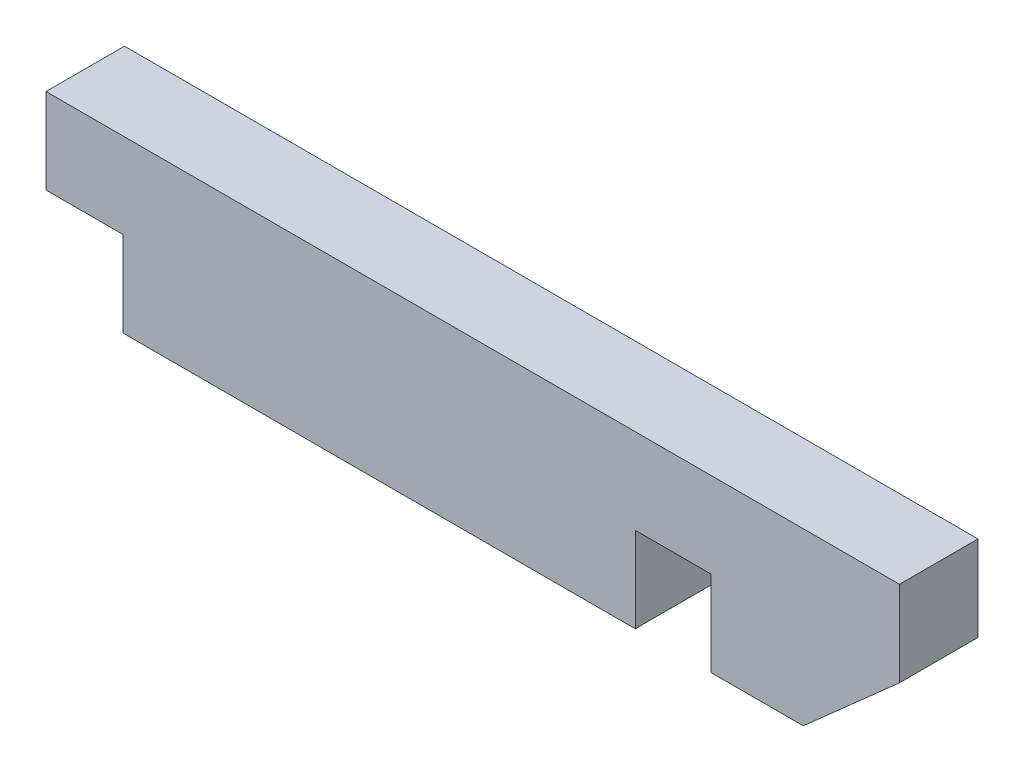
ISO-10303-21;
HEADER;
FILE_DESCRIPTION(('STEP AP214'),'2;1');
FILE_NAME('part.step','',(''),(''),'','','');
FILE_SCHEMA(('AUTOMOTIVE_DESIGN { 1 0 10303 214 1 1 1 1 }'));
ENDSEC;
DATA;
#1=APPLICATION_CONTEXT('core data for automotive mechanical design processes');
#2=APPLICATION_PROTOCOL_DEFINITION('international standard','automotive_design',2000,#1);
#3=PRODUCT_CONTEXT('',#1,'mechanical');
#4=PRODUCT('Part','Part','',(#3));
#5=PRODUCT_RELATED_PRODUCT_CATEGORY('part','',(#4));
#6=PRODUCT_DEFINITION_FORMATION('','',#4);
#7=PRODUCT_DEFINITION_CONTEXT('part definition',#1,'design');
#8=PRODUCT_DEFINITION('design','',#6,#7);
#9=PRODUCT_DEFINITION_SHAPE('','',#8);
#10=(LENGTH_UNIT() NAMED_UNIT(*) SI_UNIT(.MILLI.,.METRE.));
#11=(NAMED_UNIT(*) PLANE_ANGLE_UNIT() SI_UNIT($,.RADIAN.));
#12=(NAMED_UNIT(*) SI_UNIT($,.STERADIAN.) SOLID_ANGLE_UNIT());
#13=UNCERTAINTY_MEASURE_WITH_UNIT(LENGTH_MEASURE(1.E-05),#10,'distance_accuracy_value','');
#14=(GEOMETRIC_REPRESENTATION_CONTEXT(3) GLOBAL_UNCERTAINTY_ASSIGNED_CONTEXT((#13)) GLOBAL_UNIT_ASSIGNED_CONTEXT((#10,
#11,#12)) REPRESENTATION_CONTEXT('',''));
#15=CARTESIAN_POINT('',(0.,0.,0.));
#16=DIRECTION('',(0.,0.,1.));
#17=DIRECTION('',(1.,0.,0.));
#18=AXIS2_PLACEMENT_3D('',#15,#16,#17);
#19=CARTESIAN_POINT('',(30.8360456291812,0.,5.842));
#20=DIRECTION('',(-1.,0.,0.));
#21=DIRECTION('',(0.,0.,1.));
#22=AXIS2_PLACEMENT_3D('',#19,#20,#21);
#23=PLANE('',#22);
#24=DIRECTION('',(0.,1.,0.));
#25=VECTOR('',#24,1.);
#26=CARTESIAN_POINT('',(30.8360456291812,0.,0.));
#27=LINE('',#26,#25);
#28=CARTESIAN_POINT('',(30.8360456291812,0.,0.));
#29=VERTEX_POINT('',#28);
#30=CARTESIAN_POINT('',(30.8360456291812,6.35,0.));
#31=VERTEX_POINT('',#30);
#32=EDGE_CURVE('E147',#29,#31,#27,.T.);
#33=ORIENTED_EDGE('',*,*,#32,.T.);
#34=DIRECTION('',(0.,0.,-1.));
#35=VECTOR('',#34,1.);
#36=CARTESIAN_POINT('',(30.8360456291812,6.35,5.842));
#37=LINE('',#36,#35);
#38=CARTESIAN_POINT('',(30.8360456291812,6.35,5.842));
#39=VERTEX_POINT('',#38);
#40=EDGE_CURVE('E11',#39,#31,#37,.T.);
#41=ORIENTED_EDGE('',*,*,#40,.F.);
#42=DIRECTION('',(0.,1.,0.));
#43=VECTOR('',#42,1.);
#44=CARTESIAN_POINT('',(30.8360456291812,0.,5.842));
#45=LINE('',#44,#43);
#46=CARTESIAN_POINT('',(30.8360456291812,0.,5.842));
#47=VERTEX_POINT('',#46);
#48=EDGE_CURVE('E167',#47,#39,#45,.T.);
#49=ORIENTED_EDGE('',*,*,#48,.F.);
#50=DIRECTION('',(0.,0.,-1.));
#51=VECTOR('',#50,1.);
#52=CARTESIAN_POINT('',(30.8360456291812,0.,5.842));
#53=LINE('',#52,#51);
#54=EDGE_CURVE('E143',#47,#29,#53,.T.);
#55=ORIENTED_EDGE('',*,*,#54,.T.);
#56=EDGE_LOOP('',(#33,#41,#49,#55));
#57=FACE_BOUND('',#56,.T.);
#58=ADVANCED_FACE('F33',(#57),#23,.F.);
#59=CARTESIAN_POINT('',(30.8360456291812,6.35,5.842));
#60=DIRECTION('',(0.,1.,0.));
#61=DIRECTION('',(0.,0.,1.));
#62=AXIS2_PLACEMENT_3D('',#59,#60,#61);
#63=PLANE('',#62);
#64=DIRECTION('',(1.,0.,0.));
#65=VECTOR('',#64,1.);
#66=CARTESIAN_POINT('',(30.8360456291812,6.35,0.));
#67=LINE('',#66,#65);
#68=CARTESIAN_POINT('',(36.4780456291812,6.35,0.));
#69=VERTEX_POINT('',#68);
#70=EDGE_CURVE('E150',#31,#69,#67,.T.);
#71=ORIENTED_EDGE('',*,*,#70,.T.);
#72=DIRECTION('',(0.,0.,-1.));
#73=VECTOR('',#72,1.);
#74=CARTESIAN_POINT('',(36.4780456291812,6.35,5.842));
#75=LINE('',#74,#73);
#76=CARTESIAN_POINT('',(36.4780456291812,6.35,5.842));
#77=VERTEX_POINT('',#76);
#78=EDGE_CURVE('E41',#77,#69,#75,.T.);
#79=ORIENTED_EDGE('',*,*,#78,.F.);
#80=DIRECTION('',(1.,0.,0.));
#81=VECTOR('',#80,1.);
#82=CARTESIAN_POINT('',(30.8360456291812,6.35,5.842));
#83=LINE('',#82,#81);
#84=EDGE_CURVE('E101',#39,#77,#83,.T.);
#85=ORIENTED_EDGE('',*,*,#84,.F.);
#86=ORIENTED_EDGE('',*,*,#40,.T.);
#87=EDGE_LOOP('',(#71,#79,#85,#86));
#88=FACE_BOUND('',#87,.T.);
#89=ADVANCED_FACE('F239',(#88),#63,.F.);
#90=CARTESIAN_POINT('',(36.4780456291812,0.,5.842));
#91=DIRECTION('',(1.,0.,0.));
#92=DIRECTION('',(0.,0.,-1.));
#93=AXIS2_PLACEMENT_3D('',#90,#91,#92);
#94=PLANE('',#93);
#95=DIRECTION('',(0.,-1.,0.));
#96=VECTOR('',#95,1.);
#97=CARTESIAN_POINT('',(36.4780456291812,0.,0.));
#98=LINE('',#97,#96);
#99=CARTESIAN_POINT('',(36.4780456291812,0.,0.));
#100=VERTEX_POINT('',#99);
#101=EDGE_CURVE('E152',#69,#100,#98,.T.);
#102=ORIENTED_EDGE('',*,*,#101,.T.);
#103=DIRECTION('',(0.,0.,-1.));
#104=VECTOR('',#103,1.);
#105=CARTESIAN_POINT('',(36.4780456291812,0.,5.842));
#106=LINE('',#105,#104);
#107=CARTESIAN_POINT('',(36.4780456291812,0.,5.842));
#108=VERTEX_POINT('',#107);
#109=EDGE_CURVE('E183',#108,#100,#106,.T.);
#110=ORIENTED_EDGE('',*,*,#109,.F.);
#111=DIRECTION('',(0.,-1.,0.));
#112=VECTOR('',#111,1.);
#113=CARTESIAN_POINT('',(36.4780456291812,0.,5.842));
#114=LINE('',#113,#112);
#115=EDGE_CURVE('E191',#77,#108,#114,.T.);
#116=ORIENTED_EDGE('',*,*,#115,.F.);
#117=ORIENTED_EDGE('',*,*,#78,.T.);
#118=EDGE_LOOP('',(#102,#110,#116,#117));
#119=FACE_BOUND('',#118,.T.);
#120=ADVANCED_FACE('F189',(#119),#94,.F.);
#121=CARTESIAN_POINT('',(36.4780456291812,0.,5.842));
#122=DIRECTION('',(0.,1.,0.));
#123=DIRECTION('',(0.,0.,1.));
#124=AXIS2_PLACEMENT_3D('',#121,#122,#123);
#125=PLANE('',#124);
#126=DIRECTION('',(1.,0.,0.));
#127=VECTOR('',#126,1.);
#128=CARTESIAN_POINT('',(36.4780456291812,0.,0.));
#129=LINE('',#128,#127);
#130=CARTESIAN_POINT('',(43.3360456291812,0.,0.));
#131=VERTEX_POINT('',#130);
#132=EDGE_CURVE('E154',#100,#131,#129,.T.);
#133=ORIENTED_EDGE('',*,*,#132,.T.);
#134=DIRECTION('',(0.,0.,-1.));
#135=VECTOR('',#134,1.);
#136=CARTESIAN_POINT('',(43.3360456291812,0.,5.842));
#137=LINE('',#136,#135);
#138=CARTESIAN_POINT('',(43.3360456291812,0.,5.842));
#139=VERTEX_POINT('',#138);
#140=EDGE_CURVE('E180',#139,#131,#137,.T.);
#141=ORIENTED_EDGE('',*,*,#140,.F.);
#142=DIRECTION('',(1.,0.,0.));
#143=VECTOR('',#142,1.);
#144=CARTESIAN_POINT('',(36.4780456291812,0.,5.842));
#145=LINE('',#144,#143);
#146=EDGE_CURVE('E209',#108,#139,#145,.T.);
#147=ORIENTED_EDGE('',*,*,#146,.F.);
#148=ORIENTED_EDGE('',*,*,#109,.T.);
#149=EDGE_LOOP('',(#133,#141,#147,#148));
#150=FACE_BOUND('',#149,.T.);
#151=ADVANCED_FACE('F200',(#150),#125,.F.);
#152=CARTESIAN_POINT('',(50.4940456291812,6.35,5.842));
#153=DIRECTION('',(-0.663624031434487,0.748066270394969,0.));
#154=DIRECTION('',(-0.748066270394969,-0.663624031434487,0.));
#155=AXIS2_PLACEMENT_3D('',#152,#153,#154);
#156=PLANE('',#155);
#157=DIRECTION('',(0.748066270394969,0.663624031434487,0.));
#158=VECTOR('',#157,1.);
#159=CARTESIAN_POINT('',(50.4940456291812,6.35,0.));
#160=LINE('',#159,#158);
#161=CARTESIAN_POINT('',(50.4940456291812,6.35,0.));
#162=VERTEX_POINT('',#161);
#163=EDGE_CURVE('E156',#131,#162,#160,.T.);
#164=ORIENTED_EDGE('',*,*,#163,.T.);
#165=DIRECTION('',(0.,0.,-1.));
#166=VECTOR('',#165,1.);
#167=CARTESIAN_POINT('',(50.4940456291812,6.35,5.842));
#168=LINE('',#167,#166);
#169=CARTESIAN_POINT('',(50.4940456291812,6.35,5.842));
#170=VERTEX_POINT('',#169);
#171=EDGE_CURVE('E177',#170,#162,#168,.T.);
#172=ORIENTED_EDGE('',*,*,#171,.F.);
#173=DIRECTION('',(0.748066270394969,0.663624031434487,0.));
#174=VECTOR('',#173,1.);
#175=CARTESIAN_POINT('',(50.4940456291812,6.35,5.842));
#176=LINE('',#175,#174);
#177=EDGE_CURVE('E206',#139,#170,#176,.T.);
#178=ORIENTED_EDGE('',*,*,#177,.F.);
#179=ORIENTED_EDGE('',*,*,#140,.T.);
#180=EDGE_LOOP('',(#164,#172,#178,#179));
#181=FACE_BOUND('',#180,.T.);
#182=ADVANCED_FACE('F204',(#181),#156,.F.);
#183=CARTESIAN_POINT('',(50.4940456291812,6.35,5.842));
#184=DIRECTION('',(-1.,0.,0.));
#185=DIRECTION('',(0.,0.,1.));
#186=AXIS2_PLACEMENT_3D('',#183,#184,#185);
#187=PLANE('',#186);
#188=DIRECTION('',(0.,1.,0.));
#189=VECTOR('',#188,1.);
#190=CARTESIAN_POINT('',(50.4940456291812,6.35,0.));
#191=LINE('',#190,#189);
#192=CARTESIAN_POINT('',(50.4940456291812,12.7,0.));
#193=VERTEX_POINT('',#192);
#194=EDGE_CURVE('E158',#162,#193,#191,.T.);
#195=ORIENTED_EDGE('',*,*,#194,.T.);
#196=DIRECTION('',(0.,0.,-1.));
#197=VECTOR('',#196,1.);
#198=CARTESIAN_POINT('',(50.4940456291812,12.7,5.842));
#199=LINE('',#198,#197);
#200=CARTESIAN_POINT('',(50.4940456291812,12.7,5.842));
#201=VERTEX_POINT('',#200);
#202=EDGE_CURVE('E174',#201,#193,#199,.T.);
#203=ORIENTED_EDGE('',*,*,#202,.F.);
#204=DIRECTION('',(0.,1.,0.));
#205=VECTOR('',#204,1.);
#206=CARTESIAN_POINT('',(50.4940456291812,6.35,5.842));
#207=LINE('',#206,#205);
#208=EDGE_CURVE('E208',#170,#201,#207,.T.);
#209=ORIENTED_EDGE('',*,*,#208,.F.);
#210=ORIENTED_EDGE('',*,*,#171,.T.);
#211=EDGE_LOOP('',(#195,#203,#209,#210));
#212=FACE_BOUND('',#211,.T.);
#213=ADVANCED_FACE('F252',(#212),#187,.F.);
#214=CARTESIAN_POINT('',(-13.0059543708188,12.7,5.842));
#215=DIRECTION('',(0.,-1.,0.));
#216=DIRECTION('',(0.,0.,-1.));
#217=AXIS2_PLACEMENT_3D('',#214,#215,#216);
#218=PLANE('',#217);
#219=DIRECTION('',(-1.,0.,0.));
#220=VECTOR('',#219,1.);
#221=CARTESIAN_POINT('',(-13.0059543708188,12.7,0.));
#222=LINE('',#221,#220);
#223=CARTESIAN_POINT('',(-13.0059543708188,12.7,0.));
#224=VERTEX_POINT('',#223);
#225=EDGE_CURVE('E160',#193,#224,#222,.T.);
#226=ORIENTED_EDGE('',*,*,#225,.T.);
#227=DIRECTION('',(0.,0.,-1.));
#228=VECTOR('',#227,1.);
#229=CARTESIAN_POINT('',(-13.0059543708188,12.7,5.842));
#230=LINE('',#229,#228);
#231=CARTESIAN_POINT('',(-13.0059543708188,12.7,5.842));
#232=VERTEX_POINT('',#231);
#233=EDGE_CURVE('E171',#232,#224,#230,.T.);
#234=ORIENTED_EDGE('',*,*,#233,.F.);
#235=DIRECTION('',(-1.,0.,0.));
#236=VECTOR('',#235,1.);
#237=CARTESIAN_POINT('',(-13.0059543708188,12.7,5.842));
#238=LINE('',#237,#236);
#239=EDGE_CURVE('E211',#201,#232,#238,.T.);
#240=ORIENTED_EDGE('',*,*,#239,.F.);
#241=ORIENTED_EDGE('',*,*,#202,.T.);
#242=EDGE_LOOP('',(#226,#234,#240,#241));
#243=FACE_BOUND('',#242,.T.);
#244=ADVANCED_FACE('F220',(#243),#218,.F.);
#245=CARTESIAN_POINT('',(-13.0059543708188,6.35,5.842));
#246=DIRECTION('',(1.,0.,0.));
#247=DIRECTION('',(0.,0.,-1.));
#248=AXIS2_PLACEMENT_3D('',#245,#246,#247);
#249=PLANE('',#248);
#250=DIRECTION('',(0.,-1.,0.));
#251=VECTOR('',#250,1.);
#252=CARTESIAN_POINT('',(-13.0059543708188,6.35,0.));
#253=LINE('',#252,#251);
#254=CARTESIAN_POINT('',(-13.0059543708188,6.35,0.));
#255=VERTEX_POINT('',#254);
#256=EDGE_CURVE('E162',#224,#255,#253,.T.);
#257=ORIENTED_EDGE('',*,*,#256,.T.);
#258=DIRECTION('',(0.,0.,-1.));
#259=VECTOR('',#258,1.);
#260=CARTESIAN_POINT('',(-13.0059543708188,6.35,5.842));
#261=LINE('',#260,#259);
#262=CARTESIAN_POINT('',(-13.0059543708188,6.35,5.842));
#263=VERTEX_POINT('',#262);
#264=EDGE_CURVE('E138',#263,#255,#261,.T.);
#265=ORIENTED_EDGE('',*,*,#264,.F.);
#266=DIRECTION('',(0.,-1.,0.));
#267=VECTOR('',#266,1.);
#268=CARTESIAN_POINT('',(-13.0059543708188,6.35,5.842));
#269=LINE('',#268,#267);
#270=EDGE_CURVE('E129',#232,#263,#269,.T.);
#271=ORIENTED_EDGE('',*,*,#270,.F.);
#272=ORIENTED_EDGE('',*,*,#233,.T.);
#273=EDGE_LOOP('',(#257,#265,#271,#272));
#274=FACE_BOUND('',#273,.T.);
#275=ADVANCED_FACE('F224',(#274),#249,.F.);
#276=CARTESIAN_POINT('',(-13.0059543708188,6.35,5.842));
#277=DIRECTION('',(0.,1.,0.));
#278=DIRECTION('',(0.,0.,1.));
#279=AXIS2_PLACEMENT_3D('',#276,#277,#278);
#280=PLANE('',#279);
#281=DIRECTION('',(1.,0.,0.));
#282=VECTOR('',#281,1.);
#283=CARTESIAN_POINT('',(-13.0059543708188,6.35,0.));
#284=LINE('',#283,#282);
#285=CARTESIAN_POINT('',(-7.26395437081877,6.35,0.));
#286=VERTEX_POINT('',#285);
#287=EDGE_CURVE('E137',#255,#286,#284,.T.);
#288=ORIENTED_EDGE('',*,*,#287,.T.);
#289=DIRECTION('',(0.,0.,-1.));
#290=VECTOR('',#289,1.);
#291=CARTESIAN_POINT('',(-7.26395437081877,6.35,5.842));
#292=LINE('',#291,#290);
#293=CARTESIAN_POINT('',(-7.26395437081877,6.35,5.842));
#294=VERTEX_POINT('',#293);
#295=EDGE_CURVE('E134',#294,#286,#292,.T.);
#296=ORIENTED_EDGE('',*,*,#295,.F.);
#297=DIRECTION('',(1.,0.,0.));
#298=VECTOR('',#297,1.);
#299=CARTESIAN_POINT('',(-13.0059543708188,6.35,5.842));
#300=LINE('',#299,#298);
#301=EDGE_CURVE('E123',#263,#294,#300,.T.);
#302=ORIENTED_EDGE('',*,*,#301,.F.);
#303=ORIENTED_EDGE('',*,*,#264,.T.);
#304=EDGE_LOOP('',(#288,#296,#302,#303));
#305=FACE_BOUND('',#304,.T.);
#306=ADVANCED_FACE('F135',(#305),#280,.F.);
#307=CARTESIAN_POINT('',(-7.26395437081877,0.,5.842));
#308=DIRECTION('',(1.,0.,0.));
#309=DIRECTION('',(0.,0.,-1.));
#310=AXIS2_PLACEMENT_3D('',#307,#308,#309);
#311=PLANE('',#310);
#312=DIRECTION('',(0.,-1.,0.));
#313=VECTOR('',#312,1.);
#314=CARTESIAN_POINT('',(-7.26395437081877,0.,0.));
#315=LINE('',#314,#313);
#316=CARTESIAN_POINT('',(-7.26395437081877,0.,0.));
#317=VERTEX_POINT('',#316);
#318=EDGE_CURVE('E87',#286,#317,#315,.T.);
#319=ORIENTED_EDGE('',*,*,#318,.T.);
#320=DIRECTION('',(0.,0.,-1.));
#321=VECTOR('',#320,1.);
#322=CARTESIAN_POINT('',(-7.26395437081877,0.,5.842));
#323=LINE('',#322,#321);
#324=CARTESIAN_POINT('',(-7.26395437081877,0.,5.842));
#325=VERTEX_POINT('',#324);
#326=EDGE_CURVE('E139',#325,#317,#323,.T.);
#327=ORIENTED_EDGE('',*,*,#326,.F.);
#328=DIRECTION('',(0.,-1.,0.));
#329=VECTOR('',#328,1.);
#330=CARTESIAN_POINT('',(-7.26395437081877,0.,5.842));
#331=LINE('',#330,#329);
#332=EDGE_CURVE('E127',#294,#325,#331,.T.);
#333=ORIENTED_EDGE('',*,*,#332,.F.);
#334=ORIENTED_EDGE('',*,*,#295,.T.);
#335=EDGE_LOOP('',(#319,#327,#333,#334));
#336=FACE_BOUND('',#335,.T.);
#337=ADVANCED_FACE('F141',(#336),#311,.F.);
#338=CARTESIAN_POINT('',(-7.26395437081877,0.,5.842));
#339=DIRECTION('',(0.,1.,0.));
#340=DIRECTION('',(0.,0.,1.));
#341=AXIS2_PLACEMENT_3D('',#338,#339,#340);
#342=PLANE('',#341);
#343=DIRECTION('',(1.,0.,0.));
#344=VECTOR('',#343,1.);
#345=CARTESIAN_POINT('',(-7.26395437081877,0.,0.));
#346=LINE('',#345,#344);
#347=EDGE_CURVE('E93',#317,#29,#346,.T.);
#348=ORIENTED_EDGE('',*,*,#347,.T.);
#349=ORIENTED_EDGE('',*,*,#54,.F.);
#350=DIRECTION('',(1.,0.,0.));
#351=VECTOR('',#350,1.);
#352=CARTESIAN_POINT('',(-7.26395437081877,0.,5.842));
#353=LINE('',#352,#351);
#354=EDGE_CURVE('E49',#325,#47,#353,.T.);
#355=ORIENTED_EDGE('',*,*,#354,.F.);
#356=ORIENTED_EDGE('',*,*,#326,.T.);
#357=EDGE_LOOP('',(#348,#349,#355,#356));
#358=FACE_BOUND('',#357,.T.);
#359=ADVANCED_FACE('F228',(#358),#342,.F.);
#360=CARTESIAN_POINT('',(0.,0.,5.842));
#361=DIRECTION('',(0.,0.,-1.));
#362=DIRECTION('',(-1.,0.,0.));
#363=AXIS2_PLACEMENT_3D('',#360,#361,#362);
#364=PLANE('',#363);
#365=ORIENTED_EDGE('',*,*,#48,.T.);
#366=ORIENTED_EDGE('',*,*,#84,.T.);
#367=ORIENTED_EDGE('',*,*,#115,.T.);
#368=ORIENTED_EDGE('',*,*,#146,.T.);
#369=ORIENTED_EDGE('',*,*,#177,.T.);
#370=ORIENTED_EDGE('',*,*,#208,.T.);
#371=ORIENTED_EDGE('',*,*,#239,.T.);
#372=ORIENTED_EDGE('',*,*,#270,.T.);
#373=ORIENTED_EDGE('',*,*,#301,.T.);
#374=ORIENTED_EDGE('',*,*,#332,.T.);
#375=ORIENTED_EDGE('',*,*,#354,.T.);
#376=EDGE_LOOP('',(#365,#366,#367,#368,#369,#370,#371,#372,#373,#374,#375));
#377=FACE_BOUND('',#376,.T.);
#378=ADVANCED_FACE('F125',(#377),#364,.F.);
#379=CARTESIAN_POINT('',(0.,0.,0.));
#380=DIRECTION('',(0.,0.,-1.));
#381=DIRECTION('',(-1.,0.,0.));
#382=AXIS2_PLACEMENT_3D('',#379,#380,#381);
#383=PLANE('',#382);
#384=ORIENTED_EDGE('',*,*,#32,.F.);
#385=ORIENTED_EDGE('',*,*,#347,.F.);
#386=ORIENTED_EDGE('',*,*,#318,.F.);
#387=ORIENTED_EDGE('',*,*,#287,.F.);
#388=ORIENTED_EDGE('',*,*,#256,.F.);
#389=ORIENTED_EDGE('',*,*,#225,.F.);
#390=ORIENTED_EDGE('',*,*,#194,.F.);
#391=ORIENTED_EDGE('',*,*,#163,.F.);
#392=ORIENTED_EDGE('',*,*,#132,.F.);
#393=ORIENTED_EDGE('',*,*,#101,.F.);
#394=ORIENTED_EDGE('',*,*,#70,.F.);
#395=EDGE_LOOP('',(#384,#385,#386,#387,#388,#389,#390,#391,#392,#393,#394));
#396=FACE_BOUND('',#395,.T.);
#397=ADVANCED_FACE('F195',(#396),#383,.T.);
#398=CLOSED_SHELL('',(#58,#89,#120,#151,#182,#213,#244,#275,#306,#337,#359,#378,#397));
#399=MANIFOLD_SOLID_BREP('B2',#398);
#400=ADVANCED_BREP_SHAPE_REPRESENTATION('',(#18,#399),#14);
#401=SHAPE_DEFINITION_REPRESENTATION(#9,#400);
ENDSEC;
END-ISO-10303-21;
